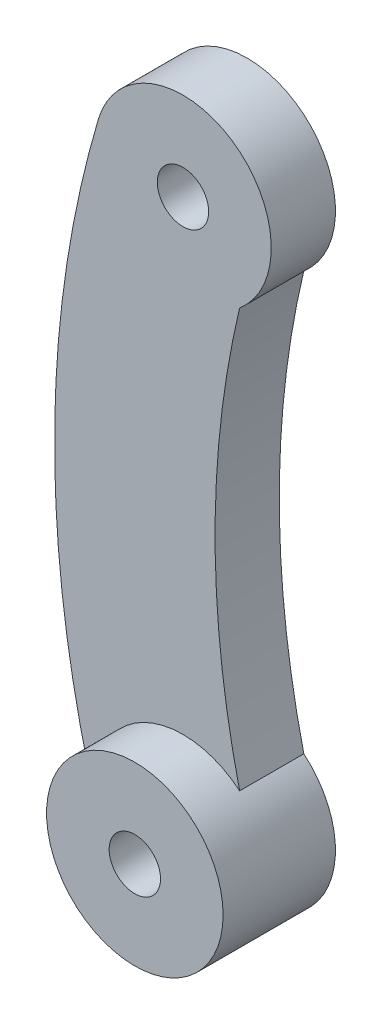
ISO-10303-21;
HEADER;
FILE_DESCRIPTION(('STEP AP214'),'2;1');
FILE_NAME('part.step','',(''),(''),'','','');
FILE_SCHEMA(('AUTOMOTIVE_DESIGN { 1 0 10303 214 1 1 1 1 }'));
ENDSEC;
DATA;
#1=APPLICATION_CONTEXT('core data for automotive mechanical design processes');
#2=APPLICATION_PROTOCOL_DEFINITION('international standard','automotive_design',2000,#1);
#3=PRODUCT_CONTEXT('',#1,'mechanical');
#4=PRODUCT('Part','Part','',(#3));
#5=PRODUCT_RELATED_PRODUCT_CATEGORY('part','',(#4));
#6=PRODUCT_DEFINITION_FORMATION('','',#4);
#7=PRODUCT_DEFINITION_CONTEXT('part definition',#1,'design');
#8=PRODUCT_DEFINITION('design','',#6,#7);
#9=PRODUCT_DEFINITION_SHAPE('','',#8);
#10=(LENGTH_UNIT() NAMED_UNIT(*) SI_UNIT(.MILLI.,.METRE.));
#11=(NAMED_UNIT(*) PLANE_ANGLE_UNIT() SI_UNIT($,.RADIAN.));
#12=(NAMED_UNIT(*) SI_UNIT($,.STERADIAN.) SOLID_ANGLE_UNIT());
#13=UNCERTAINTY_MEASURE_WITH_UNIT(LENGTH_MEASURE(1.E-05),#10,'distance_accuracy_value','');
#14=(GEOMETRIC_REPRESENTATION_CONTEXT(3) GLOBAL_UNCERTAINTY_ASSIGNED_CONTEXT((#13)) GLOBAL_UNIT_ASSIGNED_CONTEXT((#10,
#11,#12)) REPRESENTATION_CONTEXT('',''));
#15=CARTESIAN_POINT('',(0.,0.,0.));
#16=DIRECTION('',(0.,0.,1.));
#17=DIRECTION('',(1.,0.,0.));
#18=AXIS2_PLACEMENT_3D('',#15,#16,#17);
#19=CARTESIAN_POINT('',(29.1312499999998,8.625,4.));
#20=DIRECTION('',(0.,0.,1.));
#21=DIRECTION('',(1.,0.,0.));
#22=AXIS2_PLACEMENT_3D('',#19,#20,#21);
#23=PLANE('',#22);
#24=CARTESIAN_POINT('',(0.,0.,4.));
#25=DIRECTION('',(0.,0.,1.));
#26=DIRECTION('',(1.,0.,0.));
#27=AXIS2_PLACEMENT_3D('',#24,#25,#26);
#28=CIRCLE('',#27,5.5);
#29=CARTESIAN_POINT('',(3.53020723096407,4.21753920034526,4.));
#30=VERTEX_POINT('',#29);
#31=CARTESIAN_POINT('',(-5.27370911335115,-1.56140711787698,4.));
#32=VERTEX_POINT('',#31);
#33=EDGE_CURVE('E90',#30,#32,#28,.T.);
#34=ORIENTED_EDGE('',*,*,#33,.F.);
#35=CARTESIAN_POINT('',(58.2624999999997,17.25,4.));
#36=DIRECTION('',(0.,0.,-1.));
#37=DIRECTION('',(1.,0.,0.));
#38=AXIS2_PLACEMENT_3D('',#35,#36,#37);
#39=CIRCLE('',#38,56.2624999999997);
#40=CARTESIAN_POINT('',(3.53020723096406,30.2824607996547,4.));
#41=VERTEX_POINT('',#40);
#42=EDGE_CURVE('E81',#30,#41,#39,.T.);
#43=ORIENTED_EDGE('',*,*,#42,.T.);
#44=CARTESIAN_POINT('',(0.,34.5,4.));
#45=DIRECTION('',(0.,0.,1.));
#46=DIRECTION('',(1.,0.,0.));
#47=AXIS2_PLACEMENT_3D('',#44,#45,#46);
#48=CIRCLE('',#47,5.49999999999999);
#49=CARTESIAN_POINT('',(-5.27370911335115,36.061407117877,4.));
#50=VERTEX_POINT('',#49);
#51=EDGE_CURVE('E50',#41,#50,#48,.T.);
#52=ORIENTED_EDGE('',*,*,#51,.T.);
#53=CARTESIAN_POINT('',(58.2624999999997,17.25,4.));
#54=DIRECTION('',(0.,0.,1.));
#55=DIRECTION('',(1.,0.,0.));
#56=AXIS2_PLACEMENT_3D('',#53,#54,#55);
#57=CIRCLE('',#56,66.2624999999997);
#58=EDGE_CURVE('E77',#50,#32,#57,.T.);
#59=ORIENTED_EDGE('',*,*,#58,.T.);
#60=EDGE_LOOP('',(#34,#43,#52,#59));
#61=FACE_BOUND('',#60,.T.);
#62=CARTESIAN_POINT('',(0.,34.5,4.));
#63=DIRECTION('',(0.,0.,1.));
#64=DIRECTION('',(1.,0.,0.));
#65=AXIS2_PLACEMENT_3D('',#62,#63,#64);
#66=CIRCLE('',#65,1.6);
#67=CARTESIAN_POINT('',(1.6,34.5,4.));
#68=VERTEX_POINT('',#67);
#69=EDGE_CURVE('E127',#68,#68,#66,.T.);
#70=ORIENTED_EDGE('',*,*,#69,.F.);
#71=EDGE_LOOP('',(#70));
#72=FACE_BOUND('',#71,.T.);
#73=ADVANCED_FACE('F32',(#61,#72),#23,.T.);
#74=CARTESIAN_POINT('',(29.1312499999998,8.625,0.));
#75=DIRECTION('',(0.,0.,1.));
#76=DIRECTION('',(1.,0.,0.));
#77=AXIS2_PLACEMENT_3D('',#74,#75,#76);
#78=PLANE('',#77);
#79=CARTESIAN_POINT('',(58.2624999999997,17.25,0.));
#80=DIRECTION('',(0.,0.,1.));
#81=DIRECTION('',(1.,0.,0.));
#82=AXIS2_PLACEMENT_3D('',#79,#80,#81);
#83=CIRCLE('',#82,66.2624999999997);
#84=CARTESIAN_POINT('',(-5.27370911335115,36.061407117877,0.));
#85=VERTEX_POINT('',#84);
#86=CARTESIAN_POINT('',(-5.27370911335115,-1.56140711787698,0.));
#87=VERTEX_POINT('',#86);
#88=EDGE_CURVE('E126',#85,#87,#83,.T.);
#89=ORIENTED_EDGE('',*,*,#88,.F.);
#90=CARTESIAN_POINT('',(0.,34.5,0.));
#91=DIRECTION('',(0.,0.,1.));
#92=DIRECTION('',(1.,0.,0.));
#93=AXIS2_PLACEMENT_3D('',#90,#91,#92);
#94=CIRCLE('',#93,5.49999999999999);
#95=CARTESIAN_POINT('',(3.53020723096406,30.2824607996547,0.));
#96=VERTEX_POINT('',#95);
#97=EDGE_CURVE('E73',#96,#85,#94,.T.);
#98=ORIENTED_EDGE('',*,*,#97,.F.);
#99=CARTESIAN_POINT('',(58.2624999999997,17.25,0.));
#100=DIRECTION('',(0.,0.,-1.));
#101=DIRECTION('',(1.,0.,0.));
#102=AXIS2_PLACEMENT_3D('',#99,#100,#101);
#103=CIRCLE('',#102,56.2624999999997);
#104=CARTESIAN_POINT('',(3.53020723096407,4.21753920034527,0.));
#105=VERTEX_POINT('',#104);
#106=EDGE_CURVE('E68',#105,#96,#103,.T.);
#107=ORIENTED_EDGE('',*,*,#106,.F.);
#108=CARTESIAN_POINT('',(0.,0.,0.));
#109=DIRECTION('',(0.,0.,1.));
#110=DIRECTION('',(1.,0.,0.));
#111=AXIS2_PLACEMENT_3D('',#108,#109,#110);
#112=CIRCLE('',#111,5.49999999999999);
#113=EDGE_CURVE('E91',#87,#105,#112,.T.);
#114=ORIENTED_EDGE('',*,*,#113,.F.);
#115=EDGE_LOOP('',(#89,#98,#107,#114));
#116=FACE_BOUND('',#115,.T.);
#117=CARTESIAN_POINT('',(0.,34.5,0.));
#118=DIRECTION('',(0.,0.,1.));
#119=DIRECTION('',(1.,0.,0.));
#120=AXIS2_PLACEMENT_3D('',#117,#118,#119);
#121=CIRCLE('',#120,1.6);
#122=CARTESIAN_POINT('',(1.6,34.5,0.));
#123=VERTEX_POINT('',#122);
#124=EDGE_CURVE('E125',#123,#123,#121,.T.);
#125=ORIENTED_EDGE('',*,*,#124,.T.);
#126=EDGE_LOOP('',(#125));
#127=FACE_BOUND('',#126,.T.);
#128=CARTESIAN_POINT('',(0.,0.,0.));
#129=DIRECTION('',(0.,0.,1.));
#130=DIRECTION('',(1.,0.,0.));
#131=AXIS2_PLACEMENT_3D('',#128,#129,#130);
#132=CIRCLE('',#131,1.6);
#133=CARTESIAN_POINT('',(1.6,0.,0.));
#134=VERTEX_POINT('',#133);
#135=EDGE_CURVE('E98',#134,#134,#132,.T.);
#136=ORIENTED_EDGE('',*,*,#135,.T.);
#137=EDGE_LOOP('',(#136));
#138=FACE_BOUND('',#137,.T.);
#139=ADVANCED_FACE('F137',(#116,#127,#138),#78,.F.);
#140=CARTESIAN_POINT('',(58.2624999999997,17.25,4.));
#141=DIRECTION('',(0.,0.,-1.));
#142=DIRECTION('',(-1.,0.,0.));
#143=AXIS2_PLACEMENT_3D('',#140,#141,#142);
#144=CYLINDRICAL_SURFACE('',#143,66.2624999999997);
#145=ORIENTED_EDGE('',*,*,#88,.T.);
#146=DIRECTION('',(0.,0.,-1.));
#147=VECTOR('',#146,1.);
#148=CARTESIAN_POINT('',(-5.27370911335115,-1.56140711787698,4.));
#149=LINE('',#148,#147);
#150=EDGE_CURVE('E11',#32,#87,#149,.T.);
#151=ORIENTED_EDGE('',*,*,#150,.F.);
#152=ORIENTED_EDGE('',*,*,#58,.F.);
#153=DIRECTION('',(0.,0.,-1.));
#154=VECTOR('',#153,1.);
#155=CARTESIAN_POINT('',(-5.27370911335115,36.061407117877,4.));
#156=LINE('',#155,#154);
#157=EDGE_CURVE('E118',#50,#85,#156,.T.);
#158=ORIENTED_EDGE('',*,*,#157,.T.);
#159=EDGE_LOOP('',(#145,#151,#152,#158));
#160=FACE_BOUND('',#159,.T.);
#161=ADVANCED_FACE('F34',(#160),#144,.T.);
#162=CARTESIAN_POINT('',(0.,0.,4.));
#163=DIRECTION('',(0.,0.,-1.));
#164=DIRECTION('',(-1.,0.,0.));
#165=AXIS2_PLACEMENT_3D('',#162,#163,#164);
#166=CYLINDRICAL_SURFACE('',#165,5.49999999999999);
#167=ORIENTED_EDGE('',*,*,#113,.T.);
#168=DIRECTION('',(0.,0.,-1.));
#169=VECTOR('',#168,1.);
#170=CARTESIAN_POINT('',(3.53020723096407,4.21753920034527,4.));
#171=LINE('',#170,#169);
#172=EDGE_CURVE('E42',#30,#105,#171,.T.);
#173=ORIENTED_EDGE('',*,*,#172,.F.);
#174=ORIENTED_EDGE('',*,*,#33,.T.);
#175=ORIENTED_EDGE('',*,*,#150,.T.);
#176=EDGE_LOOP('',(#167,#173,#174,#175));
#177=FACE_BOUND('',#176,.T.);
#178=CARTESIAN_POINT('',(0.,0.,7.));
#179=DIRECTION('',(0.,0.,1.));
#180=DIRECTION('',(1.,0.,0.));
#181=AXIS2_PLACEMENT_3D('',#178,#179,#180);
#182=CIRCLE('',#181,5.5);
#183=CARTESIAN_POINT('',(5.5,0.,7.));
#184=VERTEX_POINT('',#183);
#185=EDGE_CURVE('E94',#184,#184,#182,.T.);
#186=ORIENTED_EDGE('',*,*,#185,.F.);
#187=EDGE_LOOP('',(#186));
#188=FACE_BOUND('',#187,.T.);
#189=ADVANCED_FACE('F88',(#177,#188),#166,.T.);
#190=CARTESIAN_POINT('',(58.2624999999997,17.25,4.));
#191=DIRECTION('',(0.,0.,-1.));
#192=DIRECTION('',(-1.,0.,0.));
#193=AXIS2_PLACEMENT_3D('',#190,#191,#192);
#194=CYLINDRICAL_SURFACE('',#193,56.2624999999997);
#195=ORIENTED_EDGE('',*,*,#106,.T.);
#196=DIRECTION('',(0.,0.,-1.));
#197=VECTOR('',#196,1.);
#198=CARTESIAN_POINT('',(3.53020723096406,30.2824607996547,4.));
#199=LINE('',#198,#197);
#200=EDGE_CURVE('E84',#41,#96,#199,.T.);
#201=ORIENTED_EDGE('',*,*,#200,.F.);
#202=ORIENTED_EDGE('',*,*,#42,.F.);
#203=ORIENTED_EDGE('',*,*,#172,.T.);
#204=EDGE_LOOP('',(#195,#201,#202,#203));
#205=FACE_BOUND('',#204,.T.);
#206=ADVANCED_FACE('F83',(#205),#194,.F.);
#207=CARTESIAN_POINT('',(0.,34.5,4.));
#208=DIRECTION('',(0.,0.,-1.));
#209=DIRECTION('',(-1.,0.,0.));
#210=AXIS2_PLACEMENT_3D('',#207,#208,#209);
#211=CYLINDRICAL_SURFACE('',#210,5.49999999999999);
#212=ORIENTED_EDGE('',*,*,#97,.T.);
#213=ORIENTED_EDGE('',*,*,#157,.F.);
#214=ORIENTED_EDGE('',*,*,#51,.F.);
#215=ORIENTED_EDGE('',*,*,#200,.T.);
#216=EDGE_LOOP('',(#212,#213,#214,#215));
#217=FACE_BOUND('',#216,.T.);
#218=ADVANCED_FACE('F161',(#217),#211,.T.);
#219=CARTESIAN_POINT('',(0.,34.5,4.));
#220=DIRECTION('',(0.,0.,-1.));
#221=DIRECTION('',(-1.,0.,0.));
#222=AXIS2_PLACEMENT_3D('',#219,#220,#221);
#223=CYLINDRICAL_SURFACE('',#222,1.6);
#224=ORIENTED_EDGE('',*,*,#69,.T.);
#225=EDGE_LOOP('',(#224));
#226=FACE_BOUND('',#225,.T.);
#227=ORIENTED_EDGE('',*,*,#124,.F.);
#228=EDGE_LOOP('',(#227));
#229=FACE_BOUND('',#228,.T.);
#230=ADVANCED_FACE('F143',(#226,#229),#223,.F.);
#231=CARTESIAN_POINT('',(0.,0.,4.));
#232=DIRECTION('',(0.,0.,-1.));
#233=DIRECTION('',(-1.,0.,0.));
#234=AXIS2_PLACEMENT_3D('',#231,#232,#233);
#235=CYLINDRICAL_SURFACE('',#234,1.6);
#236=ORIENTED_EDGE('',*,*,#135,.F.);
#237=EDGE_LOOP('',(#236));
#238=FACE_BOUND('',#237,.T.);
#239=CARTESIAN_POINT('',(0.,0.,7.));
#240=DIRECTION('',(0.,0.,1.));
#241=DIRECTION('',(1.,0.,0.));
#242=AXIS2_PLACEMENT_3D('',#239,#240,#241);
#243=CIRCLE('',#242,1.6);
#244=CARTESIAN_POINT('',(1.6,0.,7.));
#245=VERTEX_POINT('',#244);
#246=EDGE_CURVE('E95',#245,#245,#243,.T.);
#247=ORIENTED_EDGE('',*,*,#246,.T.);
#248=EDGE_LOOP('',(#247));
#249=FACE_BOUND('',#248,.T.);
#250=ADVANCED_FACE('F139',(#238,#249),#235,.F.);
#251=CARTESIAN_POINT('',(0.,0.,7.));
#252=DIRECTION('',(0.,0.,1.));
#253=DIRECTION('',(1.,0.,0.));
#254=AXIS2_PLACEMENT_3D('',#251,#252,#253);
#255=PLANE('',#254);
#256=ORIENTED_EDGE('',*,*,#185,.T.);
#257=EDGE_LOOP('',(#256));
#258=FACE_BOUND('',#257,.T.);
#259=ORIENTED_EDGE('',*,*,#246,.F.);
#260=EDGE_LOOP('',(#259));
#261=FACE_BOUND('',#260,.T.);
#262=ADVANCED_FACE('F142',(#258,#261),#255,.T.);
#263=CLOSED_SHELL('',(#73,#139,#161,#189,#206,#218,#230,#250,#262));
#264=MANIFOLD_SOLID_BREP('B2',#263);
#265=ADVANCED_BREP_SHAPE_REPRESENTATION('',(#18,#264),#14);
#266=SHAPE_DEFINITION_REPRESENTATION(#9,#265);
ENDSEC;
END-ISO-10303-21;
